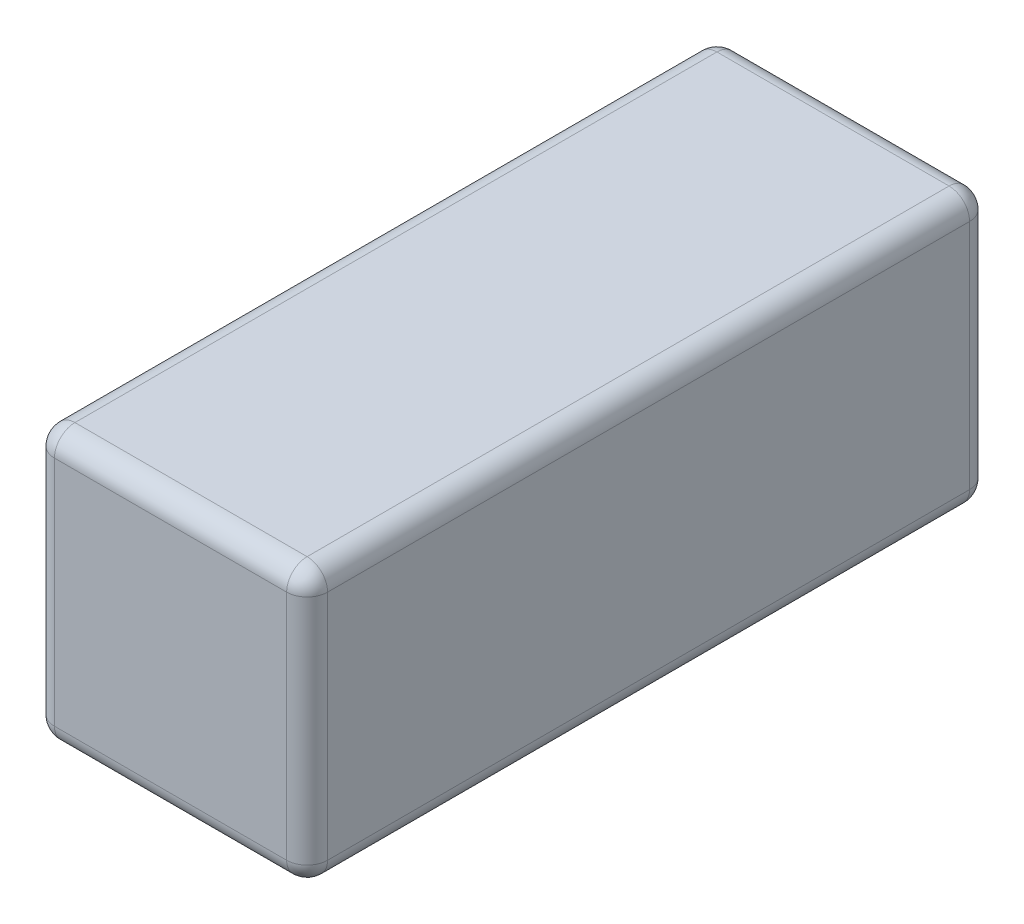
ISO-10303-21;
HEADER;
FILE_DESCRIPTION(('STEP AP214'),'2;1');
FILE_NAME('part.step','',(''),(''),'','','');
FILE_SCHEMA(('AUTOMOTIVE_DESIGN { 1 0 10303 214 1 1 1 1 }'));
ENDSEC;
DATA;
#1=APPLICATION_CONTEXT('core data for automotive mechanical design processes');
#2=APPLICATION_PROTOCOL_DEFINITION('international standard','automotive_design',2000,#1);
#3=PRODUCT_CONTEXT('',#1,'mechanical');
#4=PRODUCT('Part','Part','',(#3));
#5=PRODUCT_RELATED_PRODUCT_CATEGORY('part','',(#4));
#6=PRODUCT_DEFINITION_FORMATION('','',#4);
#7=PRODUCT_DEFINITION_CONTEXT('part definition',#1,'design');
#8=PRODUCT_DEFINITION('design','',#6,#7);
#9=PRODUCT_DEFINITION_SHAPE('','',#8);
#10=(LENGTH_UNIT() NAMED_UNIT(*) SI_UNIT(.MILLI.,.METRE.));
#11=(NAMED_UNIT(*) PLANE_ANGLE_UNIT() SI_UNIT($,.RADIAN.));
#12=(NAMED_UNIT(*) SI_UNIT($,.STERADIAN.) SOLID_ANGLE_UNIT());
#13=UNCERTAINTY_MEASURE_WITH_UNIT(LENGTH_MEASURE(1.E-05),#10,'distance_accuracy_value','');
#14=(GEOMETRIC_REPRESENTATION_CONTEXT(3) GLOBAL_UNCERTAINTY_ASSIGNED_CONTEXT((#13)) GLOBAL_UNIT_ASSIGNED_CONTEXT((#10,
#11,#12)) REPRESENTATION_CONTEXT('',''));
#15=CARTESIAN_POINT('',(0.,0.,0.));
#16=DIRECTION('',(0.,0.,1.));
#17=DIRECTION('',(1.,0.,0.));
#18=AXIS2_PLACEMENT_3D('',#15,#16,#17);
#19=CARTESIAN_POINT('',(1.,-1.,5.));
#20=DIRECTION('',(0.,1.,0.));
#21=DIRECTION('',(-1.,0.,0.));
#22=AXIS2_PLACEMENT_3D('',#19,#20,#21);
#23=PLANE('',#22);
#24=DIRECTION('',(0.,0.,-1.));
#25=VECTOR('',#24,1.);
#26=CARTESIAN_POINT('',(-0.85,-1.,5.));
#27=LINE('',#26,#25);
#28=CARTESIAN_POINT('',(-0.85,-1.,4.85));
#29=VERTEX_POINT('',#28);
#30=CARTESIAN_POINT('',(-0.85,-1.,0.15));
#31=VERTEX_POINT('',#30);
#32=EDGE_CURVE('E155',#29,#31,#27,.T.);
#33=ORIENTED_EDGE('',*,*,#32,.T.);
#34=DIRECTION('',(-1.,0.,0.));
#35=VECTOR('',#34,1.);
#36=CARTESIAN_POINT('',(1.,-1.,0.15));
#37=LINE('',#36,#35);
#38=CARTESIAN_POINT('',(0.85,-1.,0.15));
#39=VERTEX_POINT('',#38);
#40=EDGE_CURVE('E152',#31,#39,#37,.F.);
#41=ORIENTED_EDGE('',*,*,#40,.T.);
#42=DIRECTION('',(0.,0.,-1.));
#43=VECTOR('',#42,1.);
#44=CARTESIAN_POINT('',(0.85,-1.,5.));
#45=LINE('',#44,#43);
#46=CARTESIAN_POINT('',(0.85,-1.,4.85));
#47=VERTEX_POINT('',#46);
#48=EDGE_CURVE('E145',#39,#47,#45,.F.);
#49=ORIENTED_EDGE('',*,*,#48,.T.);
#50=DIRECTION('',(1.,0.,0.));
#51=VECTOR('',#50,1.);
#52=CARTESIAN_POINT('',(1.,-1.,4.85));
#53=LINE('',#52,#51);
#54=EDGE_CURVE('E149',#47,#29,#53,.F.);
#55=ORIENTED_EDGE('',*,*,#54,.T.);
#56=EDGE_LOOP('',(#33,#41,#49,#55));
#57=FACE_BOUND('',#56,.T.);
#58=ADVANCED_FACE('F55',(#57),#23,.F.);
#59=CARTESIAN_POINT('',(1.,-1.,5.));
#60=DIRECTION('',(-1.,0.,0.));
#61=DIRECTION('',(0.,0.,1.));
#62=AXIS2_PLACEMENT_3D('',#59,#60,#61);
#63=PLANE('',#62);
#64=DIRECTION('',(0.,0.,-1.));
#65=VECTOR('',#64,1.);
#66=CARTESIAN_POINT('',(1.,-0.85,5.));
#67=LINE('',#66,#65);
#68=CARTESIAN_POINT('',(1.,-0.85,4.85));
#69=VERTEX_POINT('',#68);
#70=CARTESIAN_POINT('',(1.,-0.85,0.15));
#71=VERTEX_POINT('',#70);
#72=EDGE_CURVE('E162',#69,#71,#67,.T.);
#73=ORIENTED_EDGE('',*,*,#72,.T.);
#74=DIRECTION('',(0.,-1.,0.));
#75=VECTOR('',#74,1.);
#76=CARTESIAN_POINT('',(1.,-1.,0.15));
#77=LINE('',#76,#75);
#78=CARTESIAN_POINT('',(1.,0.850000000000001,0.15));
#79=VERTEX_POINT('',#78);
#80=EDGE_CURVE('E79',#71,#79,#77,.F.);
#81=ORIENTED_EDGE('',*,*,#80,.T.);
#82=DIRECTION('',(0.,0.,-1.));
#83=VECTOR('',#82,1.);
#84=CARTESIAN_POINT('',(1.,0.850000000000001,5.));
#85=LINE('',#84,#83);
#86=CARTESIAN_POINT('',(1.,0.850000000000001,4.85));
#87=VERTEX_POINT('',#86);
#88=EDGE_CURVE('E202',#79,#87,#85,.F.);
#89=ORIENTED_EDGE('',*,*,#88,.T.);
#90=DIRECTION('',(0.,1.,0.));
#91=VECTOR('',#90,1.);
#92=CARTESIAN_POINT('',(1.,-1.,4.85));
#93=LINE('',#92,#91);
#94=EDGE_CURVE('E199',#87,#69,#93,.F.);
#95=ORIENTED_EDGE('',*,*,#94,.T.);
#96=EDGE_LOOP('',(#73,#81,#89,#95));
#97=FACE_BOUND('',#96,.T.);
#98=ADVANCED_FACE('F281',(#97),#63,.F.);
#99=CARTESIAN_POINT('',(1.,1.,5.));
#100=DIRECTION('',(0.,-1.,0.));
#101=DIRECTION('',(1.,0.,0.));
#102=AXIS2_PLACEMENT_3D('',#99,#100,#101);
#103=PLANE('',#102);
#104=DIRECTION('',(0.,0.,-1.));
#105=VECTOR('',#104,1.);
#106=CARTESIAN_POINT('',(0.85,1.,5.));
#107=LINE('',#106,#105);
#108=CARTESIAN_POINT('',(0.85,1.,4.85));
#109=VERTEX_POINT('',#108);
#110=CARTESIAN_POINT('',(0.85,1.,0.15));
#111=VERTEX_POINT('',#110);
#112=EDGE_CURVE('E195',#109,#111,#107,.T.);
#113=ORIENTED_EDGE('',*,*,#112,.T.);
#114=DIRECTION('',(1.,0.,0.));
#115=VECTOR('',#114,1.);
#116=CARTESIAN_POINT('',(1.,1.,0.15));
#117=LINE('',#116,#115);
#118=CARTESIAN_POINT('',(-0.850000000000001,1.,0.15));
#119=VERTEX_POINT('',#118);
#120=EDGE_CURVE('E11',#111,#119,#117,.F.);
#121=ORIENTED_EDGE('',*,*,#120,.T.);
#122=DIRECTION('',(0.,0.,-1.));
#123=VECTOR('',#122,1.);
#124=CARTESIAN_POINT('',(-0.850000000000001,1.,5.));
#125=LINE('',#124,#123);
#126=CARTESIAN_POINT('',(-0.850000000000001,1.,4.85));
#127=VERTEX_POINT('',#126);
#128=EDGE_CURVE('E197',#119,#127,#125,.F.);
#129=ORIENTED_EDGE('',*,*,#128,.T.);
#130=DIRECTION('',(-1.,0.,0.));
#131=VECTOR('',#130,1.);
#132=CARTESIAN_POINT('',(1.,1.,4.85));
#133=LINE('',#132,#131);
#134=EDGE_CURVE('E193',#127,#109,#133,.F.);
#135=ORIENTED_EDGE('',*,*,#134,.T.);
#136=EDGE_LOOP('',(#113,#121,#129,#135));
#137=FACE_BOUND('',#136,.T.);
#138=ADVANCED_FACE('F296',(#137),#103,.F.);
#139=CARTESIAN_POINT('',(-1.,-1.,5.));
#140=DIRECTION('',(1.,0.,0.));
#141=DIRECTION('',(0.,1.,0.));
#142=AXIS2_PLACEMENT_3D('',#139,#140,#141);
#143=PLANE('',#142);
#144=DIRECTION('',(0.,0.,-1.));
#145=VECTOR('',#144,1.);
#146=CARTESIAN_POINT('',(-1.,0.85,5.));
#147=LINE('',#146,#145);
#148=CARTESIAN_POINT('',(-1.,0.85,4.85));
#149=VERTEX_POINT('',#148);
#150=CARTESIAN_POINT('',(-1.,0.85,0.15));
#151=VERTEX_POINT('',#150);
#152=EDGE_CURVE('E188',#149,#151,#147,.T.);
#153=ORIENTED_EDGE('',*,*,#152,.T.);
#154=DIRECTION('',(0.,1.,0.));
#155=VECTOR('',#154,1.);
#156=CARTESIAN_POINT('',(-1.,-1.,0.15));
#157=LINE('',#156,#155);
#158=CARTESIAN_POINT('',(-1.,-0.85,0.15));
#159=VERTEX_POINT('',#158);
#160=EDGE_CURVE('E245',#151,#159,#157,.F.);
#161=ORIENTED_EDGE('',*,*,#160,.T.);
#162=DIRECTION('',(0.,0.,-1.));
#163=VECTOR('',#162,1.);
#164=CARTESIAN_POINT('',(-1.,-0.85,5.));
#165=LINE('',#164,#163);
#166=CARTESIAN_POINT('',(-1.,-0.85,4.85));
#167=VERTEX_POINT('',#166);
#168=EDGE_CURVE('E191',#159,#167,#165,.F.);
#169=ORIENTED_EDGE('',*,*,#168,.T.);
#170=DIRECTION('',(0.,-1.,0.));
#171=VECTOR('',#170,1.);
#172=CARTESIAN_POINT('',(-1.,-1.,4.85));
#173=LINE('',#172,#171);
#174=EDGE_CURVE('E186',#167,#149,#173,.F.);
#175=ORIENTED_EDGE('',*,*,#174,.T.);
#176=EDGE_LOOP('',(#153,#161,#169,#175));
#177=FACE_BOUND('',#176,.T.);
#178=ADVANCED_FACE('F321',(#177),#143,.F.);
#179=CARTESIAN_POINT('',(0.,0.,5.));
#180=DIRECTION('',(0.,0.,-1.));
#181=DIRECTION('',(-1.,0.,0.));
#182=AXIS2_PLACEMENT_3D('',#179,#180,#181);
#183=PLANE('',#182);
#184=DIRECTION('',(-1.,0.,0.));
#185=VECTOR('',#184,1.);
#186=CARTESIAN_POINT('',(0.,0.85,5.));
#187=LINE('',#186,#185);
#188=CARTESIAN_POINT('',(0.85,0.850000000000001,5.));
#189=VERTEX_POINT('',#188);
#190=CARTESIAN_POINT('',(-0.850000000000001,0.85,5.));
#191=VERTEX_POINT('',#190);
#192=EDGE_CURVE('E208',#189,#191,#187,.T.);
#193=ORIENTED_EDGE('',*,*,#192,.T.);
#194=DIRECTION('',(0.,-1.,0.));
#195=VECTOR('',#194,1.);
#196=CARTESIAN_POINT('',(-0.850000000000001,0.,5.));
#197=LINE('',#196,#195);
#198=CARTESIAN_POINT('',(-0.850000000000001,-0.85,5.));
#199=VERTEX_POINT('',#198);
#200=EDGE_CURVE('E210',#191,#199,#197,.T.);
#201=ORIENTED_EDGE('',*,*,#200,.T.);
#202=DIRECTION('',(1.,0.,0.));
#203=VECTOR('',#202,1.);
#204=CARTESIAN_POINT('',(0.,-0.85,5.));
#205=LINE('',#204,#203);
#206=CARTESIAN_POINT('',(0.85,-0.85,5.));
#207=VERTEX_POINT('',#206);
#208=EDGE_CURVE('E204',#199,#207,#205,.T.);
#209=ORIENTED_EDGE('',*,*,#208,.T.);
#210=DIRECTION('',(0.,1.,0.));
#211=VECTOR('',#210,1.);
#212=CARTESIAN_POINT('',(0.85,0.,5.));
#213=LINE('',#212,#211);
#214=EDGE_CURVE('E206',#207,#189,#213,.T.);
#215=ORIENTED_EDGE('',*,*,#214,.T.);
#216=EDGE_LOOP('',(#193,#201,#209,#215));
#217=FACE_BOUND('',#216,.T.);
#218=ADVANCED_FACE('F334',(#217),#183,.F.);
#219=CARTESIAN_POINT('',(0.85,0.850000000000001,5.));
#220=DIRECTION('',(0.,0.,-1.));
#221=DIRECTION('',(-1.,0.,0.));
#222=AXIS2_PLACEMENT_3D('',#219,#220,#221);
#223=CYLINDRICAL_SURFACE('',#222,0.15);
#224=ORIENTED_EDGE('',*,*,#88,.F.);
#225=CARTESIAN_POINT('',(0.85,0.850000000000001,0.15));
#226=DIRECTION('',(0.,0.,-1.));
#227=DIRECTION('',(-1.,0.,0.));
#228=AXIS2_PLACEMENT_3D('',#225,#226,#227);
#229=CIRCLE('',#228,0.15);
#230=EDGE_CURVE('E64',#79,#111,#229,.F.);
#231=ORIENTED_EDGE('',*,*,#230,.T.);
#232=ORIENTED_EDGE('',*,*,#112,.F.);
#233=CARTESIAN_POINT('',(0.85,0.850000000000001,4.85));
#234=DIRECTION('',(0.,0.,1.));
#235=DIRECTION('',(1.,0.,0.));
#236=AXIS2_PLACEMENT_3D('',#233,#234,#235);
#237=CIRCLE('',#236,0.15);
#238=EDGE_CURVE('E179',#87,#109,#237,.T.);
#239=ORIENTED_EDGE('',*,*,#238,.F.);
#240=EDGE_LOOP('',(#224,#231,#232,#239));
#241=FACE_BOUND('',#240,.T.);
#242=ADVANCED_FACE('F292',(#241),#223,.T.);
#243=CARTESIAN_POINT('',(0.85,0.850000000000001,4.85));
#244=DIRECTION('',(0.,0.,1.));
#245=DIRECTION('',(1.,0.,0.));
#246=AXIS2_PLACEMENT_3D('',#243,#244,#245);
#247=SPHERICAL_SURFACE('',#246,0.15);
#248=CARTESIAN_POINT('',(0.85,0.850000000000001,4.85));
#249=DIRECTION('',(0.,1.,0.));
#250=DIRECTION('',(0.,0.,1.));
#251=AXIS2_PLACEMENT_3D('',#248,#249,#250);
#252=CIRCLE('',#251,0.15);
#253=EDGE_CURVE('E229',#87,#189,#252,.F.);
#254=ORIENTED_EDGE('',*,*,#253,.F.);
#255=ORIENTED_EDGE('',*,*,#238,.T.);
#256=CARTESIAN_POINT('',(0.85,0.850000000000001,4.85));
#257=DIRECTION('',(1.,0.,0.));
#258=DIRECTION('',(0.,0.,-1.));
#259=AXIS2_PLACEMENT_3D('',#256,#257,#258);
#260=CIRCLE('',#259,0.15);
#261=EDGE_CURVE('E182',#189,#109,#260,.F.);
#262=ORIENTED_EDGE('',*,*,#261,.F.);
#263=EDGE_LOOP('',(#254,#255,#262));
#264=FACE_BOUND('',#263,.T.);
#265=ADVANCED_FACE('F290',(#264),#247,.T.);
#266=CARTESIAN_POINT('',(0.,0.85,4.85));
#267=DIRECTION('',(-1.,0.,0.));
#268=DIRECTION('',(0.,-1.,0.));
#269=AXIS2_PLACEMENT_3D('',#266,#267,#268);
#270=CYLINDRICAL_SURFACE('',#269,0.15);
#271=ORIENTED_EDGE('',*,*,#261,.T.);
#272=ORIENTED_EDGE('',*,*,#134,.F.);
#273=CARTESIAN_POINT('',(-0.850000000000001,0.85,4.85));
#274=DIRECTION('',(-1.,0.,0.));
#275=DIRECTION('',(0.,0.,1.));
#276=AXIS2_PLACEMENT_3D('',#273,#274,#275);
#277=CIRCLE('',#276,0.15);
#278=EDGE_CURVE('E223',#191,#127,#277,.T.);
#279=ORIENTED_EDGE('',*,*,#278,.F.);
#280=ORIENTED_EDGE('',*,*,#192,.F.);
#281=EDGE_LOOP('',(#271,#272,#279,#280));
#282=FACE_BOUND('',#281,.T.);
#283=ADVANCED_FACE('F332',(#282),#270,.T.);
#284=CARTESIAN_POINT('',(0.85,0.,4.85));
#285=DIRECTION('',(0.,1.,0.));
#286=DIRECTION('',(0.,0.,1.));
#287=AXIS2_PLACEMENT_3D('',#284,#285,#286);
#288=CYLINDRICAL_SURFACE('',#287,0.15);
#289=ORIENTED_EDGE('',*,*,#253,.T.);
#290=ORIENTED_EDGE('',*,*,#214,.F.);
#291=CARTESIAN_POINT('',(0.85,-0.85,4.85));
#292=DIRECTION('',(0.,-1.,0.));
#293=DIRECTION('',(0.,0.,-1.));
#294=AXIS2_PLACEMENT_3D('',#291,#292,#293);
#295=CIRCLE('',#294,0.15);
#296=EDGE_CURVE('E166',#69,#207,#295,.T.);
#297=ORIENTED_EDGE('',*,*,#296,.F.);
#298=ORIENTED_EDGE('',*,*,#94,.F.);
#299=EDGE_LOOP('',(#289,#290,#297,#298));
#300=FACE_BOUND('',#299,.T.);
#301=ADVANCED_FACE('F285',(#300),#288,.T.);
#302=CARTESIAN_POINT('',(0.85,-0.85,5.));
#303=DIRECTION('',(0.,0.,-1.));
#304=DIRECTION('',(-1.,0.,0.));
#305=AXIS2_PLACEMENT_3D('',#302,#303,#304);
#306=CYLINDRICAL_SURFACE('',#305,0.15);
#307=ORIENTED_EDGE('',*,*,#48,.F.);
#308=CARTESIAN_POINT('',(0.85,-0.85,0.15));
#309=DIRECTION('',(0.,0.,-1.));
#310=DIRECTION('',(-1.,0.,0.));
#311=AXIS2_PLACEMENT_3D('',#308,#309,#310);
#312=CIRCLE('',#311,0.15);
#313=EDGE_CURVE('E250',#39,#71,#312,.F.);
#314=ORIENTED_EDGE('',*,*,#313,.T.);
#315=ORIENTED_EDGE('',*,*,#72,.F.);
#316=CARTESIAN_POINT('',(0.85,-0.85,4.85));
#317=DIRECTION('',(0.,0.,1.));
#318=DIRECTION('',(1.,0.,0.));
#319=AXIS2_PLACEMENT_3D('',#316,#317,#318);
#320=CIRCLE('',#319,0.15);
#321=EDGE_CURVE('E159',#47,#69,#320,.T.);
#322=ORIENTED_EDGE('',*,*,#321,.F.);
#323=EDGE_LOOP('',(#307,#314,#315,#322));
#324=FACE_BOUND('',#323,.T.);
#325=ADVANCED_FACE('F161',(#324),#306,.T.);
#326=CARTESIAN_POINT('',(-0.850000000000001,0.85,5.));
#327=DIRECTION('',(0.,0.,-1.));
#328=DIRECTION('',(-1.,0.,0.));
#329=AXIS2_PLACEMENT_3D('',#326,#327,#328);
#330=CYLINDRICAL_SURFACE('',#329,0.15);
#331=ORIENTED_EDGE('',*,*,#128,.F.);
#332=CARTESIAN_POINT('',(-0.850000000000001,0.85,0.15));
#333=DIRECTION('',(0.,0.,-1.));
#334=DIRECTION('',(-1.,0.,0.));
#335=AXIS2_PLACEMENT_3D('',#332,#333,#334);
#336=CIRCLE('',#335,0.15);
#337=EDGE_CURVE('E213',#119,#151,#336,.F.);
#338=ORIENTED_EDGE('',*,*,#337,.T.);
#339=ORIENTED_EDGE('',*,*,#152,.F.);
#340=CARTESIAN_POINT('',(-0.850000000000001,0.85,4.85));
#341=DIRECTION('',(0.,0.,1.));
#342=DIRECTION('',(1.,0.,0.));
#343=AXIS2_PLACEMENT_3D('',#340,#341,#342);
#344=CIRCLE('',#343,0.15);
#345=EDGE_CURVE('E226',#127,#149,#344,.T.);
#346=ORIENTED_EDGE('',*,*,#345,.F.);
#347=EDGE_LOOP('',(#331,#338,#339,#346));
#348=FACE_BOUND('',#347,.T.);
#349=ADVANCED_FACE('F319',(#348),#330,.T.);
#350=CARTESIAN_POINT('',(-0.850000000000001,0.85,4.85));
#351=DIRECTION('',(0.,0.,1.));
#352=DIRECTION('',(1.,0.,0.));
#353=AXIS2_PLACEMENT_3D('',#350,#351,#352);
#354=SPHERICAL_SURFACE('',#353,0.15);
#355=ORIENTED_EDGE('',*,*,#278,.T.);
#356=ORIENTED_EDGE('',*,*,#345,.T.);
#357=CARTESIAN_POINT('',(-0.850000000000001,0.85,4.85));
#358=DIRECTION('',(0.,1.,0.));
#359=DIRECTION('',(0.,0.,1.));
#360=AXIS2_PLACEMENT_3D('',#357,#358,#359);
#361=CIRCLE('',#360,0.15);
#362=EDGE_CURVE('E167',#191,#149,#361,.F.);
#363=ORIENTED_EDGE('',*,*,#362,.F.);
#364=EDGE_LOOP('',(#355,#356,#363));
#365=FACE_BOUND('',#364,.T.);
#366=ADVANCED_FACE('F329',(#365),#354,.T.);
#367=CARTESIAN_POINT('',(0.85,-0.85,4.85));
#368=DIRECTION('',(0.,0.,1.));
#369=DIRECTION('',(1.,0.,0.));
#370=AXIS2_PLACEMENT_3D('',#367,#368,#369);
#371=SPHERICAL_SURFACE('',#370,0.15);
#372=ORIENTED_EDGE('',*,*,#321,.T.);
#373=ORIENTED_EDGE('',*,*,#296,.T.);
#374=CARTESIAN_POINT('',(0.85,-0.85,4.85));
#375=DIRECTION('',(1.,0.,0.));
#376=DIRECTION('',(0.,1.,0.));
#377=AXIS2_PLACEMENT_3D('',#374,#375,#376);
#378=CIRCLE('',#377,0.15);
#379=EDGE_CURVE('E170',#47,#207,#378,.F.);
#380=ORIENTED_EDGE('',*,*,#379,.F.);
#381=EDGE_LOOP('',(#372,#373,#380));
#382=FACE_BOUND('',#381,.T.);
#383=ADVANCED_FACE('F171',(#382),#371,.T.);
#384=CARTESIAN_POINT('',(-0.850000000000001,0.,4.85));
#385=DIRECTION('',(0.,-1.,0.));
#386=DIRECTION('',(1.,0.,0.));
#387=AXIS2_PLACEMENT_3D('',#384,#385,#386);
#388=CYLINDRICAL_SURFACE('',#387,0.15);
#389=ORIENTED_EDGE('',*,*,#362,.T.);
#390=ORIENTED_EDGE('',*,*,#174,.F.);
#391=CARTESIAN_POINT('',(-0.850000000000001,-0.85,4.85));
#392=DIRECTION('',(0.,-1.,0.));
#393=DIRECTION('',(0.,0.,-1.));
#394=AXIS2_PLACEMENT_3D('',#391,#392,#393);
#395=CIRCLE('',#394,0.15);
#396=EDGE_CURVE('E174',#199,#167,#395,.T.);
#397=ORIENTED_EDGE('',*,*,#396,.F.);
#398=ORIENTED_EDGE('',*,*,#200,.F.);
#399=EDGE_LOOP('',(#389,#390,#397,#398));
#400=FACE_BOUND('',#399,.T.);
#401=ADVANCED_FACE('F325',(#400),#388,.T.);
#402=CARTESIAN_POINT('',(0.,-0.85,4.85));
#403=DIRECTION('',(1.,0.,0.));
#404=DIRECTION('',(0.,1.,0.));
#405=AXIS2_PLACEMENT_3D('',#402,#403,#404);
#406=CYLINDRICAL_SURFACE('',#405,0.15);
#407=ORIENTED_EDGE('',*,*,#379,.T.);
#408=ORIENTED_EDGE('',*,*,#208,.F.);
#409=CARTESIAN_POINT('',(-0.850000000000001,-0.850000000000001,4.85));
#410=DIRECTION('',(-1.,0.,0.));
#411=DIRECTION('',(0.,-1.,0.));
#412=AXIS2_PLACEMENT_3D('',#409,#410,#411);
#413=CIRCLE('',#412,0.15);
#414=EDGE_CURVE('E177',#29,#199,#413,.T.);
#415=ORIENTED_EDGE('',*,*,#414,.F.);
#416=ORIENTED_EDGE('',*,*,#54,.F.);
#417=EDGE_LOOP('',(#407,#408,#415,#416));
#418=FACE_BOUND('',#417,.T.);
#419=ADVANCED_FACE('F176',(#418),#406,.T.);
#420=CARTESIAN_POINT('',(-0.850000000000001,-0.85,4.85));
#421=DIRECTION('',(0.,0.,1.));
#422=DIRECTION('',(1.,0.,0.));
#423=AXIS2_PLACEMENT_3D('',#420,#421,#422);
#424=SPHERICAL_SURFACE('',#423,0.15);
#425=ORIENTED_EDGE('',*,*,#414,.T.);
#426=ORIENTED_EDGE('',*,*,#396,.T.);
#427=CARTESIAN_POINT('',(-0.850000000000001,-0.85,4.85));
#428=DIRECTION('',(0.,0.,1.));
#429=DIRECTION('',(1.,0.,0.));
#430=AXIS2_PLACEMENT_3D('',#427,#428,#429);
#431=CIRCLE('',#430,0.15);
#432=EDGE_CURVE('E214',#29,#167,#431,.F.);
#433=ORIENTED_EDGE('',*,*,#432,.F.);
#434=EDGE_LOOP('',(#425,#426,#433));
#435=FACE_BOUND('',#434,.T.);
#436=ADVANCED_FACE('F358',(#435),#424,.T.);
#437=CARTESIAN_POINT('',(-0.850000000000001,-0.85,5.));
#438=DIRECTION('',(0.,0.,-1.));
#439=DIRECTION('',(-1.,0.,0.));
#440=AXIS2_PLACEMENT_3D('',#437,#438,#439);
#441=CYLINDRICAL_SURFACE('',#440,0.15);
#442=ORIENTED_EDGE('',*,*,#168,.F.);
#443=CARTESIAN_POINT('',(-0.850000000000001,-0.85,0.15));
#444=DIRECTION('',(0.,0.,-1.));
#445=DIRECTION('',(-1.,0.,0.));
#446=AXIS2_PLACEMENT_3D('',#443,#444,#445);
#447=CIRCLE('',#446,0.15);
#448=EDGE_CURVE('E247',#159,#31,#447,.F.);
#449=ORIENTED_EDGE('',*,*,#448,.T.);
#450=ORIENTED_EDGE('',*,*,#32,.F.);
#451=ORIENTED_EDGE('',*,*,#432,.T.);
#452=EDGE_LOOP('',(#442,#449,#450,#451));
#453=FACE_BOUND('',#452,.T.);
#454=ADVANCED_FACE('F354',(#453),#441,.T.);
#455=CARTESIAN_POINT('',(0.,0.,0.));
#456=DIRECTION('',(0.,0.,1.));
#457=DIRECTION('',(1.,0.,0.));
#458=AXIS2_PLACEMENT_3D('',#455,#456,#457);
#459=PLANE('',#458);
#460=DIRECTION('',(-1.,0.,0.));
#461=VECTOR('',#460,1.);
#462=CARTESIAN_POINT('',(0.,-0.85,0.));
#463=LINE('',#462,#461);
#464=CARTESIAN_POINT('',(0.85,-0.85,0.));
#465=VERTEX_POINT('',#464);
#466=CARTESIAN_POINT('',(-0.850000000000001,-0.85,0.));
#467=VERTEX_POINT('',#466);
#468=EDGE_CURVE('E240',#465,#467,#463,.T.);
#469=ORIENTED_EDGE('',*,*,#468,.T.);
#470=DIRECTION('',(0.,1.,0.));
#471=VECTOR('',#470,1.);
#472=CARTESIAN_POINT('',(-0.850000000000001,0.,0.));
#473=LINE('',#472,#471);
#474=CARTESIAN_POINT('',(-0.850000000000001,0.85,0.));
#475=VERTEX_POINT('',#474);
#476=EDGE_CURVE('E242',#467,#475,#473,.T.);
#477=ORIENTED_EDGE('',*,*,#476,.T.);
#478=DIRECTION('',(1.,0.,0.));
#479=VECTOR('',#478,1.);
#480=CARTESIAN_POINT('',(0.,0.85,0.));
#481=LINE('',#480,#479);
#482=CARTESIAN_POINT('',(0.85,0.850000000000001,0.));
#483=VERTEX_POINT('',#482);
#484=EDGE_CURVE('E236',#475,#483,#481,.T.);
#485=ORIENTED_EDGE('',*,*,#484,.T.);
#486=DIRECTION('',(0.,-1.,0.));
#487=VECTOR('',#486,1.);
#488=CARTESIAN_POINT('',(0.85,0.,0.));
#489=LINE('',#488,#487);
#490=EDGE_CURVE('E238',#483,#465,#489,.T.);
#491=ORIENTED_EDGE('',*,*,#490,.T.);
#492=EDGE_LOOP('',(#469,#477,#485,#491));
#493=FACE_BOUND('',#492,.T.);
#494=ADVANCED_FACE('F357',(#493),#459,.F.);
#495=CARTESIAN_POINT('',(0.85,-0.85,0.15));
#496=DIRECTION('',(0.,0.,1.));
#497=DIRECTION('',(1.,0.,0.));
#498=AXIS2_PLACEMENT_3D('',#495,#496,#497);
#499=SPHERICAL_SURFACE('',#498,0.15);
#500=CARTESIAN_POINT('',(0.85,-0.85,0.15));
#501=DIRECTION('',(0.,1.,0.));
#502=DIRECTION('',(0.,0.,1.));
#503=AXIS2_PLACEMENT_3D('',#500,#501,#502);
#504=CIRCLE('',#503,0.15);
#505=EDGE_CURVE('E269',#71,#465,#504,.T.);
#506=ORIENTED_EDGE('',*,*,#505,.F.);
#507=ORIENTED_EDGE('',*,*,#313,.F.);
#508=CARTESIAN_POINT('',(0.85,-0.85,0.15));
#509=DIRECTION('',(-1.,0.,0.));
#510=DIRECTION('',(0.,-1.,0.));
#511=AXIS2_PLACEMENT_3D('',#508,#509,#510);
#512=CIRCLE('',#511,0.15);
#513=EDGE_CURVE('E59',#465,#39,#512,.T.);
#514=ORIENTED_EDGE('',*,*,#513,.F.);
#515=EDGE_LOOP('',(#506,#507,#514));
#516=FACE_BOUND('',#515,.T.);
#517=ADVANCED_FACE('F57',(#516),#499,.T.);
#518=CARTESIAN_POINT('',(0.,-0.85,0.15));
#519=DIRECTION('',(-1.,0.,0.));
#520=DIRECTION('',(0.,-1.,0.));
#521=AXIS2_PLACEMENT_3D('',#518,#519,#520);
#522=CYLINDRICAL_SURFACE('',#521,0.15);
#523=ORIENTED_EDGE('',*,*,#513,.T.);
#524=ORIENTED_EDGE('',*,*,#40,.F.);
#525=CARTESIAN_POINT('',(-0.850000000000001,-0.85,0.15));
#526=DIRECTION('',(-1.,0.,0.));
#527=DIRECTION('',(0.,-1.,0.));
#528=AXIS2_PLACEMENT_3D('',#525,#526,#527);
#529=CIRCLE('',#528,0.15);
#530=EDGE_CURVE('E267',#467,#31,#529,.T.);
#531=ORIENTED_EDGE('',*,*,#530,.F.);
#532=ORIENTED_EDGE('',*,*,#468,.F.);
#533=EDGE_LOOP('',(#523,#524,#531,#532));
#534=FACE_BOUND('',#533,.T.);
#535=ADVANCED_FACE('F278',(#534),#522,.T.);
#536=CARTESIAN_POINT('',(0.85,0.,0.15));
#537=DIRECTION('',(0.,-1.,0.));
#538=DIRECTION('',(0.,0.,-1.));
#539=AXIS2_PLACEMENT_3D('',#536,#537,#538);
#540=CYLINDRICAL_SURFACE('',#539,0.15);
#541=ORIENTED_EDGE('',*,*,#505,.T.);
#542=ORIENTED_EDGE('',*,*,#490,.F.);
#543=CARTESIAN_POINT('',(0.85,0.850000000000001,0.15));
#544=DIRECTION('',(0.,1.,0.));
#545=DIRECTION('',(0.,0.,1.));
#546=AXIS2_PLACEMENT_3D('',#543,#544,#545);
#547=CIRCLE('',#546,0.15);
#548=EDGE_CURVE('E264',#79,#483,#547,.T.);
#549=ORIENTED_EDGE('',*,*,#548,.F.);
#550=ORIENTED_EDGE('',*,*,#80,.F.);
#551=EDGE_LOOP('',(#541,#542,#549,#550));
#552=FACE_BOUND('',#551,.T.);
#553=ADVANCED_FACE('F390',(#552),#540,.T.);
#554=CARTESIAN_POINT('',(-0.850000000000001,-0.85,0.15));
#555=DIRECTION('',(0.,0.,1.));
#556=DIRECTION('',(1.,0.,0.));
#557=AXIS2_PLACEMENT_3D('',#554,#555,#556);
#558=SPHERICAL_SURFACE('',#557,0.15);
#559=ORIENTED_EDGE('',*,*,#530,.T.);
#560=ORIENTED_EDGE('',*,*,#448,.F.);
#561=CARTESIAN_POINT('',(-0.850000000000001,-0.85,0.15));
#562=DIRECTION('',(0.,1.,0.));
#563=DIRECTION('',(0.,0.,1.));
#564=AXIS2_PLACEMENT_3D('',#561,#562,#563);
#565=CIRCLE('',#564,0.15);
#566=EDGE_CURVE('E261',#467,#159,#565,.T.);
#567=ORIENTED_EDGE('',*,*,#566,.F.);
#568=EDGE_LOOP('',(#559,#560,#567));
#569=FACE_BOUND('',#568,.T.);
#570=ADVANCED_FACE('F387',(#569),#558,.T.);
#571=CARTESIAN_POINT('',(0.85,0.850000000000001,0.15));
#572=DIRECTION('',(0.,0.,1.));
#573=DIRECTION('',(1.,0.,0.));
#574=AXIS2_PLACEMENT_3D('',#571,#572,#573);
#575=SPHERICAL_SURFACE('',#574,0.15);
#576=ORIENTED_EDGE('',*,*,#230,.F.);
#577=ORIENTED_EDGE('',*,*,#548,.T.);
#578=CARTESIAN_POINT('',(0.85,0.850000000000001,0.15));
#579=DIRECTION('',(-1.,0.,0.));
#580=DIRECTION('',(0.,0.,1.));
#581=AXIS2_PLACEMENT_3D('',#578,#579,#580);
#582=CIRCLE('',#581,0.15);
#583=EDGE_CURVE('E258',#111,#483,#582,.T.);
#584=ORIENTED_EDGE('',*,*,#583,.F.);
#585=EDGE_LOOP('',(#576,#577,#584));
#586=FACE_BOUND('',#585,.T.);
#587=ADVANCED_FACE('F301',(#586),#575,.T.);
#588=CARTESIAN_POINT('',(-0.850000000000001,0.,0.15));
#589=DIRECTION('',(0.,1.,0.));
#590=DIRECTION('',(-1.,0.,0.));
#591=AXIS2_PLACEMENT_3D('',#588,#589,#590);
#592=CYLINDRICAL_SURFACE('',#591,0.15);
#593=ORIENTED_EDGE('',*,*,#566,.T.);
#594=ORIENTED_EDGE('',*,*,#160,.F.);
#595=CARTESIAN_POINT('',(-0.850000000000001,0.85,0.15));
#596=DIRECTION('',(0.,1.,0.));
#597=DIRECTION('',(0.,0.,1.));
#598=AXIS2_PLACEMENT_3D('',#595,#596,#597);
#599=CIRCLE('',#598,0.15);
#600=EDGE_CURVE('E256',#475,#151,#599,.T.);
#601=ORIENTED_EDGE('',*,*,#600,.F.);
#602=ORIENTED_EDGE('',*,*,#476,.F.);
#603=EDGE_LOOP('',(#593,#594,#601,#602));
#604=FACE_BOUND('',#603,.T.);
#605=ADVANCED_FACE('F313',(#604),#592,.T.);
#606=CARTESIAN_POINT('',(0.,0.85,0.15));
#607=DIRECTION('',(1.,0.,0.));
#608=DIRECTION('',(0.,1.,0.));
#609=AXIS2_PLACEMENT_3D('',#606,#607,#608);
#610=CYLINDRICAL_SURFACE('',#609,0.15);
#611=ORIENTED_EDGE('',*,*,#583,.T.);
#612=ORIENTED_EDGE('',*,*,#484,.F.);
#613=CARTESIAN_POINT('',(-0.850000000000001,0.85,0.15));
#614=DIRECTION('',(-1.,0.,0.));
#615=DIRECTION('',(0.,0.,1.));
#616=AXIS2_PLACEMENT_3D('',#613,#614,#615);
#617=CIRCLE('',#616,0.15);
#618=EDGE_CURVE('E254',#119,#475,#617,.T.);
#619=ORIENTED_EDGE('',*,*,#618,.F.);
#620=ORIENTED_EDGE('',*,*,#120,.F.);
#621=EDGE_LOOP('',(#611,#612,#619,#620));
#622=FACE_BOUND('',#621,.T.);
#623=ADVANCED_FACE('F305',(#622),#610,.T.);
#624=CARTESIAN_POINT('',(-0.850000000000001,0.85,0.15));
#625=DIRECTION('',(0.,0.,1.));
#626=DIRECTION('',(1.,0.,0.));
#627=AXIS2_PLACEMENT_3D('',#624,#625,#626);
#628=SPHERICAL_SURFACE('',#627,0.15);
#629=ORIENTED_EDGE('',*,*,#600,.T.);
#630=ORIENTED_EDGE('',*,*,#337,.F.);
#631=ORIENTED_EDGE('',*,*,#618,.T.);
#632=EDGE_LOOP('',(#629,#630,#631));
#633=FACE_BOUND('',#632,.T.);
#634=ADVANCED_FACE('F309',(#633),#628,.T.);
#635=CLOSED_SHELL('',(#58,#98,#138,#178,#218,#242,#265,#283,#301,#325,#349,#366,#383,#401,#419,
#436,#454,#494,#517,#535,#553,#570,#587,#605,#623,#634));
#636=MANIFOLD_SOLID_BREP('B2',#635);
#637=ADVANCED_BREP_SHAPE_REPRESENTATION('',(#18,#636),#14);
#638=SHAPE_DEFINITION_REPRESENTATION(#9,#637);
ENDSEC;
END-ISO-10303-21;
